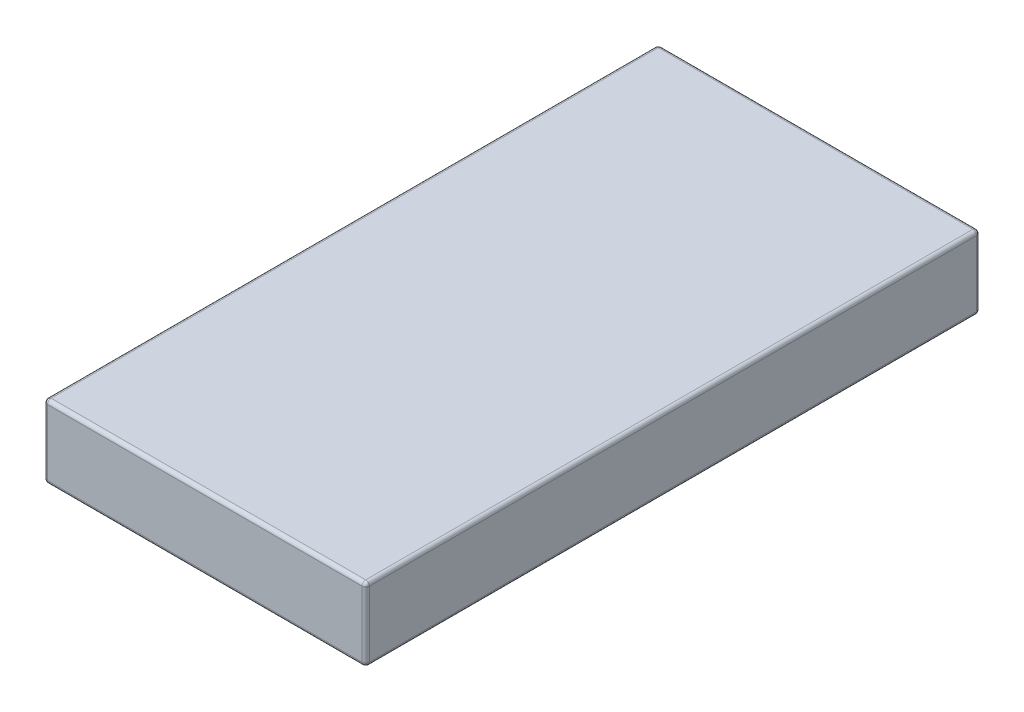
ISO-10303-21;
HEADER;
FILE_DESCRIPTION(('STEP AP214'),'2;1');
FILE_NAME('part.step','',(''),(''),'','','');
FILE_SCHEMA(('AUTOMOTIVE_DESIGN { 1 0 10303 214 1 1 1 1 }'));
ENDSEC;
DATA;
#1=APPLICATION_CONTEXT('core data for automotive mechanical design processes');
#2=APPLICATION_PROTOCOL_DEFINITION('international standard','automotive_design',2000,#1);
#3=PRODUCT_CONTEXT('',#1,'mechanical');
#4=PRODUCT('Part','Part','',(#3));
#5=PRODUCT_RELATED_PRODUCT_CATEGORY('part','',(#4));
#6=PRODUCT_DEFINITION_FORMATION('','',#4);
#7=PRODUCT_DEFINITION_CONTEXT('part definition',#1,'design');
#8=PRODUCT_DEFINITION('design','',#6,#7);
#9=PRODUCT_DEFINITION_SHAPE('','',#8);
#10=(LENGTH_UNIT() NAMED_UNIT(*) SI_UNIT(.MILLI.,.METRE.));
#11=(NAMED_UNIT(*) PLANE_ANGLE_UNIT() SI_UNIT($,.RADIAN.));
#12=(NAMED_UNIT(*) SI_UNIT($,.STERADIAN.) SOLID_ANGLE_UNIT());
#13=UNCERTAINTY_MEASURE_WITH_UNIT(LENGTH_MEASURE(1.E-05),#10,'distance_accuracy_value','');
#14=(GEOMETRIC_REPRESENTATION_CONTEXT(3) GLOBAL_UNCERTAINTY_ASSIGNED_CONTEXT((#13)) GLOBAL_UNIT_ASSIGNED_CONTEXT((#10,
#11,#12)) REPRESENTATION_CONTEXT('',''));
#15=CARTESIAN_POINT('',(0.,0.,0.));
#16=DIRECTION('',(0.,0.,1.));
#17=DIRECTION('',(1.,0.,0.));
#18=AXIS2_PLACEMENT_3D('',#15,#16,#17);
#19=CARTESIAN_POINT('',(0.,10.,0.));
#20=DIRECTION('',(1.,0.,0.));
#21=DIRECTION('',(0.,0.,-1.));
#22=AXIS2_PLACEMENT_3D('',#19,#20,#21);
#23=PLANE('',#22);
#24=DIRECTION('',(0.,-1.,0.));
#25=VECTOR('',#24,1.);
#26=CARTESIAN_POINT('',(0.,10.,-83.5));
#27=LINE('',#26,#25);
#28=CARTESIAN_POINT('',(0.,9.5,-83.5));
#29=VERTEX_POINT('',#28);
#30=CARTESIAN_POINT('',(0.,0.5,-83.5));
#31=VERTEX_POINT('',#30);
#32=EDGE_CURVE('E134',#29,#31,#27,.T.);
#33=ORIENTED_EDGE('',*,*,#32,.T.);
#34=DIRECTION('',(0.,0.,1.));
#35=VECTOR('',#34,1.);
#36=CARTESIAN_POINT('',(0.,0.5,0.));
#37=LINE('',#36,#35);
#38=CARTESIAN_POINT('',(0.,0.5,-0.5));
#39=VERTEX_POINT('',#38);
#40=EDGE_CURVE('E130',#31,#39,#37,.T.);
#41=ORIENTED_EDGE('',*,*,#40,.T.);
#42=DIRECTION('',(0.,-1.,0.));
#43=VECTOR('',#42,1.);
#44=CARTESIAN_POINT('',(0.,10.,-0.5));
#45=LINE('',#44,#43);
#46=CARTESIAN_POINT('',(0.,9.5,-0.5));
#47=VERTEX_POINT('',#46);
#48=EDGE_CURVE('E123',#39,#47,#45,.F.);
#49=ORIENTED_EDGE('',*,*,#48,.T.);
#50=DIRECTION('',(0.,0.,1.));
#51=VECTOR('',#50,1.);
#52=CARTESIAN_POINT('',(0.,9.5,0.));
#53=LINE('',#52,#51);
#54=EDGE_CURVE('E127',#47,#29,#53,.F.);
#55=ORIENTED_EDGE('',*,*,#54,.T.);
#56=EDGE_LOOP('',(#33,#41,#49,#55));
#57=FACE_BOUND('',#56,.T.);
#58=ADVANCED_FACE('F35',(#57),#23,.F.);
#59=CARTESIAN_POINT('',(0.,10.,0.));
#60=DIRECTION('',(0.,0.,-1.));
#61=DIRECTION('',(-1.,0.,0.));
#62=AXIS2_PLACEMENT_3D('',#59,#60,#61);
#63=PLANE('',#62);
#64=DIRECTION('',(0.,-1.,0.));
#65=VECTOR('',#64,1.);
#66=CARTESIAN_POINT('',(0.5,10.,0.));
#67=LINE('',#66,#65);
#68=CARTESIAN_POINT('',(0.5,9.5,0.));
#69=VERTEX_POINT('',#68);
#70=CARTESIAN_POINT('',(0.5,0.5,0.));
#71=VERTEX_POINT('',#70);
#72=EDGE_CURVE('E142',#69,#71,#67,.T.);
#73=ORIENTED_EDGE('',*,*,#72,.T.);
#74=DIRECTION('',(1.,0.,0.));
#75=VECTOR('',#74,1.);
#76=CARTESIAN_POINT('',(44.,0.5,0.));
#77=LINE('',#76,#75);
#78=CARTESIAN_POINT('',(43.5,0.5,0.));
#79=VERTEX_POINT('',#78);
#80=EDGE_CURVE('E189',#71,#79,#77,.T.);
#81=ORIENTED_EDGE('',*,*,#80,.T.);
#82=DIRECTION('',(0.,-1.,0.));
#83=VECTOR('',#82,1.);
#84=CARTESIAN_POINT('',(43.5,10.,0.));
#85=LINE('',#84,#83);
#86=CARTESIAN_POINT('',(43.5,9.5,0.));
#87=VERTEX_POINT('',#86);
#88=EDGE_CURVE('E186',#79,#87,#85,.F.);
#89=ORIENTED_EDGE('',*,*,#88,.T.);
#90=DIRECTION('',(1.,0.,0.));
#91=VECTOR('',#90,1.);
#92=CARTESIAN_POINT('',(0.,9.5,0.));
#93=LINE('',#92,#91);
#94=EDGE_CURVE('E184',#87,#69,#93,.F.);
#95=ORIENTED_EDGE('',*,*,#94,.T.);
#96=EDGE_LOOP('',(#73,#81,#89,#95));
#97=FACE_BOUND('',#96,.T.);
#98=ADVANCED_FACE('F295',(#97),#63,.F.);
#99=CARTESIAN_POINT('',(44.,10.,0.));
#100=DIRECTION('',(-1.,0.,0.));
#101=DIRECTION('',(0.,0.,1.));
#102=AXIS2_PLACEMENT_3D('',#99,#100,#101);
#103=PLANE('',#102);
#104=DIRECTION('',(0.,-1.,0.));
#105=VECTOR('',#104,1.);
#106=CARTESIAN_POINT('',(44.,10.,-0.5));
#107=LINE('',#106,#105);
#108=CARTESIAN_POINT('',(44.,9.5,-0.5));
#109=VERTEX_POINT('',#108);
#110=CARTESIAN_POINT('',(44.,0.5,-0.5));
#111=VERTEX_POINT('',#110);
#112=EDGE_CURVE('E177',#109,#111,#107,.T.);
#113=ORIENTED_EDGE('',*,*,#112,.T.);
#114=DIRECTION('',(0.,0.,-1.));
#115=VECTOR('',#114,1.);
#116=CARTESIAN_POINT('',(44.,0.5,-84.));
#117=LINE('',#116,#115);
#118=CARTESIAN_POINT('',(44.,0.5,-83.5));
#119=VERTEX_POINT('',#118);
#120=EDGE_CURVE('E182',#111,#119,#117,.T.);
#121=ORIENTED_EDGE('',*,*,#120,.T.);
#122=DIRECTION('',(0.,-1.,0.));
#123=VECTOR('',#122,1.);
#124=CARTESIAN_POINT('',(44.,10.,-83.5));
#125=LINE('',#124,#123);
#126=CARTESIAN_POINT('',(44.,9.5,-83.5));
#127=VERTEX_POINT('',#126);
#128=EDGE_CURVE('E179',#119,#127,#125,.F.);
#129=ORIENTED_EDGE('',*,*,#128,.T.);
#130=DIRECTION('',(0.,0.,-1.));
#131=VECTOR('',#130,1.);
#132=CARTESIAN_POINT('',(44.,9.5,0.));
#133=LINE('',#132,#131);
#134=EDGE_CURVE('E175',#127,#109,#133,.F.);
#135=ORIENTED_EDGE('',*,*,#134,.T.);
#136=EDGE_LOOP('',(#113,#121,#129,#135));
#137=FACE_BOUND('',#136,.T.);
#138=ADVANCED_FACE('F274',(#137),#103,.F.);
#139=CARTESIAN_POINT('',(0.,10.,-84.));
#140=DIRECTION('',(0.,0.,1.));
#141=DIRECTION('',(1.,0.,0.));
#142=AXIS2_PLACEMENT_3D('',#139,#140,#141);
#143=PLANE('',#142);
#144=DIRECTION('',(0.,-1.,0.));
#145=VECTOR('',#144,1.);
#146=CARTESIAN_POINT('',(43.5,10.,-84.));
#147=LINE('',#146,#145);
#148=CARTESIAN_POINT('',(43.5,9.5,-84.));
#149=VERTEX_POINT('',#148);
#150=CARTESIAN_POINT('',(43.5,0.5,-84.));
#151=VERTEX_POINT('',#150);
#152=EDGE_CURVE('E168',#149,#151,#147,.T.);
#153=ORIENTED_EDGE('',*,*,#152,.T.);
#154=DIRECTION('',(-1.,0.,0.));
#155=VECTOR('',#154,1.);
#156=CARTESIAN_POINT('',(0.,0.5,-84.));
#157=LINE('',#156,#155);
#158=CARTESIAN_POINT('',(0.499999999999986,0.5,-84.));
#159=VERTEX_POINT('',#158);
#160=EDGE_CURVE('E173',#151,#159,#157,.T.);
#161=ORIENTED_EDGE('',*,*,#160,.T.);
#162=DIRECTION('',(0.,-1.,0.));
#163=VECTOR('',#162,1.);
#164=CARTESIAN_POINT('',(0.499999999999986,10.,-84.));
#165=LINE('',#164,#163);
#166=CARTESIAN_POINT('',(0.499999999999986,9.5,-84.));
#167=VERTEX_POINT('',#166);
#168=EDGE_CURVE('E170',#159,#167,#165,.F.);
#169=ORIENTED_EDGE('',*,*,#168,.T.);
#170=DIRECTION('',(-1.,0.,0.));
#171=VECTOR('',#170,1.);
#172=CARTESIAN_POINT('',(0.,9.5,-84.));
#173=LINE('',#172,#171);
#174=EDGE_CURVE('E166',#167,#149,#173,.F.);
#175=ORIENTED_EDGE('',*,*,#174,.T.);
#176=EDGE_LOOP('',(#153,#161,#169,#175));
#177=FACE_BOUND('',#176,.T.);
#178=ADVANCED_FACE('F302',(#177),#143,.F.);
#179=CARTESIAN_POINT('',(0.,10.,0.));
#180=DIRECTION('',(0.,-1.,0.));
#181=DIRECTION('',(0.,0.,-1.));
#182=AXIS2_PLACEMENT_3D('',#179,#180,#181);
#183=PLANE('',#182);
#184=DIRECTION('',(0.,0.,-1.));
#185=VECTOR('',#184,1.);
#186=CARTESIAN_POINT('',(43.5,10.,0.));
#187=LINE('',#186,#185);
#188=CARTESIAN_POINT('',(43.5,10.,-0.5));
#189=VERTEX_POINT('',#188);
#190=CARTESIAN_POINT('',(43.5,10.,-83.5));
#191=VERTEX_POINT('',#190);
#192=EDGE_CURVE('E44',#189,#191,#187,.T.);
#193=ORIENTED_EDGE('',*,*,#192,.T.);
#194=DIRECTION('',(-1.,0.,0.));
#195=VECTOR('',#194,1.);
#196=CARTESIAN_POINT('',(0.,10.,-83.5));
#197=LINE('',#196,#195);
#198=CARTESIAN_POINT('',(0.499999999999986,10.,-83.5));
#199=VERTEX_POINT('',#198);
#200=EDGE_CURVE('E11',#191,#199,#197,.T.);
#201=ORIENTED_EDGE('',*,*,#200,.T.);
#202=DIRECTION('',(0.,0.,1.));
#203=VECTOR('',#202,1.);
#204=CARTESIAN_POINT('',(0.5,10.,0.));
#205=LINE('',#204,#203);
#206=CARTESIAN_POINT('',(0.5,10.,-0.5));
#207=VERTEX_POINT('',#206);
#208=EDGE_CURVE('E200',#199,#207,#205,.T.);
#209=ORIENTED_EDGE('',*,*,#208,.T.);
#210=DIRECTION('',(1.,0.,0.));
#211=VECTOR('',#210,1.);
#212=CARTESIAN_POINT('',(0.,10.,-0.5));
#213=LINE('',#212,#211);
#214=EDGE_CURVE('E55',#207,#189,#213,.T.);
#215=ORIENTED_EDGE('',*,*,#214,.T.);
#216=EDGE_LOOP('',(#193,#201,#209,#215));
#217=FACE_BOUND('',#216,.T.);
#218=ADVANCED_FACE('F366',(#217),#183,.F.);
#219=CARTESIAN_POINT('',(0.,0.,0.));
#220=DIRECTION('',(0.,-1.,0.));
#221=DIRECTION('',(0.,0.,-1.));
#222=AXIS2_PLACEMENT_3D('',#219,#220,#221);
#223=PLANE('',#222);
#224=DIRECTION('',(0.,0.,-1.));
#225=VECTOR('',#224,1.);
#226=CARTESIAN_POINT('',(43.5,0.,0.));
#227=LINE('',#226,#225);
#228=CARTESIAN_POINT('',(43.5,0.,-83.5));
#229=VERTEX_POINT('',#228);
#230=CARTESIAN_POINT('',(43.5,0.,-0.5));
#231=VERTEX_POINT('',#230);
#232=EDGE_CURVE('E195',#229,#231,#227,.F.);
#233=ORIENTED_EDGE('',*,*,#232,.T.);
#234=DIRECTION('',(1.,0.,0.));
#235=VECTOR('',#234,1.);
#236=CARTESIAN_POINT('',(0.,0.,-0.5));
#237=LINE('',#236,#235);
#238=CARTESIAN_POINT('',(0.5,0.,-0.5));
#239=VERTEX_POINT('',#238);
#240=EDGE_CURVE('E197',#231,#239,#237,.F.);
#241=ORIENTED_EDGE('',*,*,#240,.T.);
#242=DIRECTION('',(0.,0.,1.));
#243=VECTOR('',#242,1.);
#244=CARTESIAN_POINT('',(0.499999999999986,0.,-84.));
#245=LINE('',#244,#243);
#246=CARTESIAN_POINT('',(0.499999999999986,0.,-83.5));
#247=VERTEX_POINT('',#246);
#248=EDGE_CURVE('E191',#239,#247,#245,.F.);
#249=ORIENTED_EDGE('',*,*,#248,.T.);
#250=DIRECTION('',(-1.,0.,0.));
#251=VECTOR('',#250,1.);
#252=CARTESIAN_POINT('',(44.,0.,-83.5));
#253=LINE('',#252,#251);
#254=EDGE_CURVE('E193',#247,#229,#253,.F.);
#255=ORIENTED_EDGE('',*,*,#254,.T.);
#256=EDGE_LOOP('',(#233,#241,#249,#255));
#257=FACE_BOUND('',#256,.T.);
#258=ADVANCED_FACE('F266',(#257),#223,.T.);
#259=CARTESIAN_POINT('',(43.5,10.,-0.5));
#260=DIRECTION('',(0.,-1.,0.));
#261=DIRECTION('',(0.,0.,-1.));
#262=AXIS2_PLACEMENT_3D('',#259,#260,#261);
#263=CYLINDRICAL_SURFACE('',#262,0.5);
#264=CARTESIAN_POINT('',(43.5,9.5,-0.5));
#265=DIRECTION('',(0.,1.,0.));
#266=DIRECTION('',(0.,0.,1.));
#267=AXIS2_PLACEMENT_3D('',#264,#265,#266);
#268=CIRCLE('',#267,0.5);
#269=EDGE_CURVE('E39',#87,#109,#268,.T.);
#270=ORIENTED_EDGE('',*,*,#269,.F.);
#271=ORIENTED_EDGE('',*,*,#88,.F.);
#272=CARTESIAN_POINT('',(43.5,0.5,-0.5));
#273=DIRECTION('',(0.,-1.,0.));
#274=DIRECTION('',(0.,0.,-1.));
#275=AXIS2_PLACEMENT_3D('',#272,#273,#274);
#276=CIRCLE('',#275,0.5);
#277=EDGE_CURVE('E162',#111,#79,#276,.T.);
#278=ORIENTED_EDGE('',*,*,#277,.F.);
#279=ORIENTED_EDGE('',*,*,#112,.F.);
#280=EDGE_LOOP('',(#270,#271,#278,#279));
#281=FACE_BOUND('',#280,.T.);
#282=ADVANCED_FACE('F37',(#281),#263,.T.);
#283=CARTESIAN_POINT('',(43.5,9.5,-0.5));
#284=DIRECTION('',(0.,0.,1.));
#285=DIRECTION('',(1.,0.,0.));
#286=AXIS2_PLACEMENT_3D('',#283,#284,#285);
#287=SPHERICAL_SURFACE('',#286,0.5);
#288=CARTESIAN_POINT('',(43.5,9.5,-0.5));
#289=DIRECTION('',(1.,0.,0.));
#290=DIRECTION('',(0.,0.,-1.));
#291=AXIS2_PLACEMENT_3D('',#288,#289,#290);
#292=CIRCLE('',#291,0.5);
#293=EDGE_CURVE('E246',#87,#189,#292,.F.);
#294=ORIENTED_EDGE('',*,*,#293,.F.);
#295=ORIENTED_EDGE('',*,*,#269,.T.);
#296=CARTESIAN_POINT('',(43.5,9.5,-0.5));
#297=DIRECTION('',(0.,0.,1.));
#298=DIRECTION('',(1.,0.,0.));
#299=AXIS2_PLACEMENT_3D('',#296,#297,#298);
#300=CIRCLE('',#299,0.5);
#301=EDGE_CURVE('E248',#189,#109,#300,.F.);
#302=ORIENTED_EDGE('',*,*,#301,.F.);
#303=EDGE_LOOP('',(#294,#295,#302));
#304=FACE_BOUND('',#303,.T.);
#305=ADVANCED_FACE('F290',(#304),#287,.T.);
#306=CARTESIAN_POINT('',(43.5,0.5,-0.5));
#307=DIRECTION('',(0.,0.,1.));
#308=DIRECTION('',(1.,0.,0.));
#309=AXIS2_PLACEMENT_3D('',#306,#307,#308);
#310=SPHERICAL_SURFACE('',#309,0.5);
#311=CARTESIAN_POINT('',(43.5,0.5,-0.5));
#312=DIRECTION('',(0.,0.,1.));
#313=DIRECTION('',(1.,0.,0.));
#314=AXIS2_PLACEMENT_3D('',#311,#312,#313);
#315=CIRCLE('',#314,0.5);
#316=EDGE_CURVE('E240',#111,#231,#315,.F.);
#317=ORIENTED_EDGE('',*,*,#316,.F.);
#318=ORIENTED_EDGE('',*,*,#277,.T.);
#319=CARTESIAN_POINT('',(43.5,0.5,-0.5));
#320=DIRECTION('',(1.,0.,0.));
#321=DIRECTION('',(0.,0.,-1.));
#322=AXIS2_PLACEMENT_3D('',#319,#320,#321);
#323=CIRCLE('',#322,0.5);
#324=EDGE_CURVE('E243',#231,#79,#323,.F.);
#325=ORIENTED_EDGE('',*,*,#324,.F.);
#326=EDGE_LOOP('',(#317,#318,#325));
#327=FACE_BOUND('',#326,.T.);
#328=ADVANCED_FACE('F255',(#327),#310,.T.);
#329=CARTESIAN_POINT('',(43.5,9.5,0.));
#330=DIRECTION('',(0.,0.,-1.));
#331=DIRECTION('',(-1.,0.,0.));
#332=AXIS2_PLACEMENT_3D('',#329,#330,#331);
#333=CYLINDRICAL_SURFACE('',#332,0.5);
#334=ORIENTED_EDGE('',*,*,#301,.T.);
#335=ORIENTED_EDGE('',*,*,#134,.F.);
#336=CARTESIAN_POINT('',(43.5,9.5,-83.5));
#337=DIRECTION('',(0.,0.,-1.));
#338=DIRECTION('',(-1.,0.,0.));
#339=AXIS2_PLACEMENT_3D('',#336,#337,#338);
#340=CIRCLE('',#339,0.5);
#341=EDGE_CURVE('E235',#191,#127,#340,.T.);
#342=ORIENTED_EDGE('',*,*,#341,.F.);
#343=ORIENTED_EDGE('',*,*,#192,.F.);
#344=EDGE_LOOP('',(#334,#335,#342,#343));
#345=FACE_BOUND('',#344,.T.);
#346=ADVANCED_FACE('F285',(#345),#333,.T.);
#347=CARTESIAN_POINT('',(0.,9.5,-0.5));
#348=DIRECTION('',(1.,0.,0.));
#349=DIRECTION('',(0.,0.,-1.));
#350=AXIS2_PLACEMENT_3D('',#347,#348,#349);
#351=CYLINDRICAL_SURFACE('',#350,0.5);
#352=ORIENTED_EDGE('',*,*,#293,.T.);
#353=ORIENTED_EDGE('',*,*,#214,.F.);
#354=CARTESIAN_POINT('',(0.5,9.5,-0.5));
#355=DIRECTION('',(-1.,0.,0.));
#356=DIRECTION('',(0.,0.,1.));
#357=AXIS2_PLACEMENT_3D('',#354,#355,#356);
#358=CIRCLE('',#357,0.5);
#359=EDGE_CURVE('E146',#69,#207,#358,.T.);
#360=ORIENTED_EDGE('',*,*,#359,.F.);
#361=ORIENTED_EDGE('',*,*,#94,.F.);
#362=EDGE_LOOP('',(#352,#353,#360,#361));
#363=FACE_BOUND('',#362,.T.);
#364=ADVANCED_FACE('F293',(#363),#351,.T.);
#365=CARTESIAN_POINT('',(0.5,10.,-0.5));
#366=DIRECTION('',(0.,-1.,0.));
#367=DIRECTION('',(0.,0.,-1.));
#368=AXIS2_PLACEMENT_3D('',#365,#366,#367);
#369=CYLINDRICAL_SURFACE('',#368,0.5);
#370=CARTESIAN_POINT('',(0.5,0.5,-0.5));
#371=DIRECTION('',(0.,-1.,0.));
#372=DIRECTION('',(0.,0.,-1.));
#373=AXIS2_PLACEMENT_3D('',#370,#371,#372);
#374=CIRCLE('',#373,0.5);
#375=EDGE_CURVE('E147',#71,#39,#374,.T.);
#376=ORIENTED_EDGE('',*,*,#375,.F.);
#377=ORIENTED_EDGE('',*,*,#72,.F.);
#378=CARTESIAN_POINT('',(0.5,9.5,-0.5));
#379=DIRECTION('',(0.,1.,0.));
#380=DIRECTION('',(0.,0.,1.));
#381=AXIS2_PLACEMENT_3D('',#378,#379,#380);
#382=CIRCLE('',#381,0.5);
#383=EDGE_CURVE('E138',#47,#69,#382,.T.);
#384=ORIENTED_EDGE('',*,*,#383,.F.);
#385=ORIENTED_EDGE('',*,*,#48,.F.);
#386=EDGE_LOOP('',(#376,#377,#384,#385));
#387=FACE_BOUND('',#386,.T.);
#388=ADVANCED_FACE('F140',(#387),#369,.T.);
#389=CARTESIAN_POINT('',(0.,0.5,-0.5));
#390=DIRECTION('',(-1.,0.,0.));
#391=DIRECTION('',(0.,0.,1.));
#392=AXIS2_PLACEMENT_3D('',#389,#390,#391);
#393=CYLINDRICAL_SURFACE('',#392,0.5);
#394=ORIENTED_EDGE('',*,*,#324,.T.);
#395=ORIENTED_EDGE('',*,*,#80,.F.);
#396=CARTESIAN_POINT('',(0.5,0.5,-0.5));
#397=DIRECTION('',(-1.,0.,0.));
#398=DIRECTION('',(0.,0.,1.));
#399=AXIS2_PLACEMENT_3D('',#396,#397,#398);
#400=CIRCLE('',#399,0.5);
#401=EDGE_CURVE('E231',#239,#71,#400,.T.);
#402=ORIENTED_EDGE('',*,*,#401,.F.);
#403=ORIENTED_EDGE('',*,*,#240,.F.);
#404=EDGE_LOOP('',(#394,#395,#402,#403));
#405=FACE_BOUND('',#404,.T.);
#406=ADVANCED_FACE('F263',(#405),#393,.T.);
#407=CARTESIAN_POINT('',(43.5,0.5,0.));
#408=DIRECTION('',(0.,0.,1.));
#409=DIRECTION('',(1.,0.,0.));
#410=AXIS2_PLACEMENT_3D('',#407,#408,#409);
#411=CYLINDRICAL_SURFACE('',#410,0.5);
#412=ORIENTED_EDGE('',*,*,#316,.T.);
#413=ORIENTED_EDGE('',*,*,#232,.F.);
#414=CARTESIAN_POINT('',(43.5,0.5,-83.5));
#415=DIRECTION('',(0.,0.,-1.));
#416=DIRECTION('',(-1.,0.,0.));
#417=AXIS2_PLACEMENT_3D('',#414,#415,#416);
#418=CIRCLE('',#417,0.5);
#419=EDGE_CURVE('E228',#119,#229,#418,.T.);
#420=ORIENTED_EDGE('',*,*,#419,.F.);
#421=ORIENTED_EDGE('',*,*,#120,.F.);
#422=EDGE_LOOP('',(#412,#413,#420,#421));
#423=FACE_BOUND('',#422,.T.);
#424=ADVANCED_FACE('F271',(#423),#411,.T.);
#425=CARTESIAN_POINT('',(43.5,10.,-83.5));
#426=DIRECTION('',(0.,-1.,0.));
#427=DIRECTION('',(0.,0.,-1.));
#428=AXIS2_PLACEMENT_3D('',#425,#426,#427);
#429=CYLINDRICAL_SURFACE('',#428,0.5);
#430=CARTESIAN_POINT('',(43.5,9.5,-83.5));
#431=DIRECTION('',(0.,1.,0.));
#432=DIRECTION('',(0.,0.,1.));
#433=AXIS2_PLACEMENT_3D('',#430,#431,#432);
#434=CIRCLE('',#433,0.5);
#435=EDGE_CURVE('E237',#127,#149,#434,.T.);
#436=ORIENTED_EDGE('',*,*,#435,.F.);
#437=ORIENTED_EDGE('',*,*,#128,.F.);
#438=CARTESIAN_POINT('',(43.5,0.5,-83.5));
#439=DIRECTION('',(0.,-1.,0.));
#440=DIRECTION('',(0.,0.,-1.));
#441=AXIS2_PLACEMENT_3D('',#438,#439,#440);
#442=CIRCLE('',#441,0.5);
#443=EDGE_CURVE('E225',#151,#119,#442,.T.);
#444=ORIENTED_EDGE('',*,*,#443,.F.);
#445=ORIENTED_EDGE('',*,*,#152,.F.);
#446=EDGE_LOOP('',(#436,#437,#444,#445));
#447=FACE_BOUND('',#446,.T.);
#448=ADVANCED_FACE('F278',(#447),#429,.T.);
#449=CARTESIAN_POINT('',(43.5,9.5,-83.5));
#450=DIRECTION('',(0.,0.,1.));
#451=DIRECTION('',(1.,0.,0.));
#452=AXIS2_PLACEMENT_3D('',#449,#450,#451);
#453=SPHERICAL_SURFACE('',#452,0.5);
#454=ORIENTED_EDGE('',*,*,#341,.T.);
#455=ORIENTED_EDGE('',*,*,#435,.T.);
#456=CARTESIAN_POINT('',(43.5,9.5,-83.5));
#457=DIRECTION('',(1.,0.,0.));
#458=DIRECTION('',(0.,0.,-1.));
#459=AXIS2_PLACEMENT_3D('',#456,#457,#458);
#460=CIRCLE('',#459,0.5);
#461=EDGE_CURVE('E154',#191,#149,#460,.F.);
#462=ORIENTED_EDGE('',*,*,#461,.F.);
#463=EDGE_LOOP('',(#454,#455,#462));
#464=FACE_BOUND('',#463,.T.);
#465=ADVANCED_FACE('F343',(#464),#453,.T.);
#466=CARTESIAN_POINT('',(0.5,9.5,-0.5));
#467=DIRECTION('',(0.,0.,1.));
#468=DIRECTION('',(1.,0.,0.));
#469=AXIS2_PLACEMENT_3D('',#466,#467,#468);
#470=SPHERICAL_SURFACE('',#469,0.5);
#471=ORIENTED_EDGE('',*,*,#383,.T.);
#472=ORIENTED_EDGE('',*,*,#359,.T.);
#473=CARTESIAN_POINT('',(0.5,9.5,-0.5));
#474=DIRECTION('',(0.,0.,1.));
#475=DIRECTION('',(1.,0.,0.));
#476=AXIS2_PLACEMENT_3D('',#473,#474,#475);
#477=CIRCLE('',#476,0.5);
#478=EDGE_CURVE('E150',#47,#207,#477,.F.);
#479=ORIENTED_EDGE('',*,*,#478,.F.);
#480=EDGE_LOOP('',(#471,#472,#479));
#481=FACE_BOUND('',#480,.T.);
#482=ADVANCED_FACE('F151',(#481),#470,.T.);
#483=CARTESIAN_POINT('',(0.5,0.5,-0.5));
#484=DIRECTION('',(0.,0.,1.));
#485=DIRECTION('',(1.,0.,0.));
#486=AXIS2_PLACEMENT_3D('',#483,#484,#485);
#487=SPHERICAL_SURFACE('',#486,0.5);
#488=ORIENTED_EDGE('',*,*,#401,.T.);
#489=ORIENTED_EDGE('',*,*,#375,.T.);
#490=CARTESIAN_POINT('',(0.5,0.5,-0.5));
#491=DIRECTION('',(0.,0.,1.));
#492=DIRECTION('',(1.,0.,0.));
#493=AXIS2_PLACEMENT_3D('',#490,#491,#492);
#494=CIRCLE('',#493,0.5);
#495=EDGE_CURVE('E155',#239,#39,#494,.F.);
#496=ORIENTED_EDGE('',*,*,#495,.F.);
#497=EDGE_LOOP('',(#488,#489,#496));
#498=FACE_BOUND('',#497,.T.);
#499=ADVANCED_FACE('F336',(#498),#487,.T.);
#500=CARTESIAN_POINT('',(43.5,0.5,-83.5));
#501=DIRECTION('',(0.,0.,1.));
#502=DIRECTION('',(1.,0.,0.));
#503=AXIS2_PLACEMENT_3D('',#500,#501,#502);
#504=SPHERICAL_SURFACE('',#503,0.5);
#505=ORIENTED_EDGE('',*,*,#443,.T.);
#506=ORIENTED_EDGE('',*,*,#419,.T.);
#507=CARTESIAN_POINT('',(43.5,0.5,-83.5));
#508=DIRECTION('',(1.,0.,0.));
#509=DIRECTION('',(0.,0.,-1.));
#510=AXIS2_PLACEMENT_3D('',#507,#508,#509);
#511=CIRCLE('',#510,0.5);
#512=EDGE_CURVE('E218',#151,#229,#511,.F.);
#513=ORIENTED_EDGE('',*,*,#512,.F.);
#514=EDGE_LOOP('',(#505,#506,#513));
#515=FACE_BOUND('',#514,.T.);
#516=ADVANCED_FACE('F332',(#515),#504,.T.);
#517=CARTESIAN_POINT('',(0.,9.5,-83.5));
#518=DIRECTION('',(-1.,0.,0.));
#519=DIRECTION('',(0.,0.,1.));
#520=AXIS2_PLACEMENT_3D('',#517,#518,#519);
#521=CYLINDRICAL_SURFACE('',#520,0.5);
#522=ORIENTED_EDGE('',*,*,#461,.T.);
#523=ORIENTED_EDGE('',*,*,#174,.F.);
#524=CARTESIAN_POINT('',(0.499999999999986,9.5,-83.5));
#525=DIRECTION('',(-1.,0.,0.));
#526=DIRECTION('',(0.,0.,1.));
#527=AXIS2_PLACEMENT_3D('',#524,#525,#526);
#528=CIRCLE('',#527,0.5);
#529=EDGE_CURVE('E215',#199,#167,#528,.T.);
#530=ORIENTED_EDGE('',*,*,#529,.F.);
#531=ORIENTED_EDGE('',*,*,#200,.F.);
#532=EDGE_LOOP('',(#522,#523,#530,#531));
#533=FACE_BOUND('',#532,.T.);
#534=ADVANCED_FACE('F329',(#533),#521,.T.);
#535=CARTESIAN_POINT('',(0.5,9.5,0.));
#536=DIRECTION('',(0.,0.,1.));
#537=DIRECTION('',(1.,0.,0.));
#538=AXIS2_PLACEMENT_3D('',#535,#536,#537);
#539=CYLINDRICAL_SURFACE('',#538,0.5);
#540=ORIENTED_EDGE('',*,*,#478,.T.);
#541=ORIENTED_EDGE('',*,*,#208,.F.);
#542=CARTESIAN_POINT('',(0.499999999999986,9.5,-83.5));
#543=DIRECTION('',(0.,0.,-1.));
#544=DIRECTION('',(-1.,0.,0.));
#545=AXIS2_PLACEMENT_3D('',#542,#543,#544);
#546=CIRCLE('',#545,0.5);
#547=EDGE_CURVE('E158',#29,#199,#546,.T.);
#548=ORIENTED_EDGE('',*,*,#547,.F.);
#549=ORIENTED_EDGE('',*,*,#54,.F.);
#550=EDGE_LOOP('',(#540,#541,#548,#549));
#551=FACE_BOUND('',#550,.T.);
#552=ADVANCED_FACE('F157',(#551),#539,.T.);
#553=CARTESIAN_POINT('',(0.5,0.5,0.));
#554=DIRECTION('',(0.,0.,-1.));
#555=DIRECTION('',(-1.,0.,0.));
#556=AXIS2_PLACEMENT_3D('',#553,#554,#555);
#557=CYLINDRICAL_SURFACE('',#556,0.5);
#558=ORIENTED_EDGE('',*,*,#495,.T.);
#559=ORIENTED_EDGE('',*,*,#40,.F.);
#560=CARTESIAN_POINT('',(0.499999999999986,0.5,-83.5));
#561=DIRECTION('',(0.,0.,-1.));
#562=DIRECTION('',(-1.,0.,0.));
#563=AXIS2_PLACEMENT_3D('',#560,#561,#562);
#564=CIRCLE('',#563,0.5);
#565=EDGE_CURVE('E211',#247,#31,#564,.T.);
#566=ORIENTED_EDGE('',*,*,#565,.F.);
#567=ORIENTED_EDGE('',*,*,#248,.F.);
#568=EDGE_LOOP('',(#558,#559,#566,#567));
#569=FACE_BOUND('',#568,.T.);
#570=ADVANCED_FACE('F322',(#569),#557,.T.);
#571=CARTESIAN_POINT('',(0.,0.5,-83.5));
#572=DIRECTION('',(1.,0.,0.));
#573=DIRECTION('',(0.,0.,-1.));
#574=AXIS2_PLACEMENT_3D('',#571,#572,#573);
#575=CYLINDRICAL_SURFACE('',#574,0.5);
#576=ORIENTED_EDGE('',*,*,#512,.T.);
#577=ORIENTED_EDGE('',*,*,#254,.F.);
#578=CARTESIAN_POINT('',(0.499999999999986,0.5,-83.5));
#579=DIRECTION('',(-1.,0.,0.));
#580=DIRECTION('',(0.,0.,1.));
#581=AXIS2_PLACEMENT_3D('',#578,#579,#580);
#582=CIRCLE('',#581,0.5);
#583=EDGE_CURVE('E208',#159,#247,#582,.T.);
#584=ORIENTED_EDGE('',*,*,#583,.F.);
#585=ORIENTED_EDGE('',*,*,#160,.F.);
#586=EDGE_LOOP('',(#576,#577,#584,#585));
#587=FACE_BOUND('',#586,.T.);
#588=ADVANCED_FACE('F318',(#587),#575,.T.);
#589=CARTESIAN_POINT('',(0.499999999999986,9.5,-83.5));
#590=DIRECTION('',(0.,0.,1.));
#591=DIRECTION('',(1.,0.,0.));
#592=AXIS2_PLACEMENT_3D('',#589,#590,#591);
#593=SPHERICAL_SURFACE('',#592,0.5);
#594=ORIENTED_EDGE('',*,*,#547,.T.);
#595=ORIENTED_EDGE('',*,*,#529,.T.);
#596=CARTESIAN_POINT('',(0.499999999999986,9.5,-83.5));
#597=DIRECTION('',(0.,1.,0.));
#598=DIRECTION('',(0.,0.,1.));
#599=AXIS2_PLACEMENT_3D('',#596,#597,#598);
#600=CIRCLE('',#599,0.5);
#601=EDGE_CURVE('E206',#29,#167,#600,.F.);
#602=ORIENTED_EDGE('',*,*,#601,.F.);
#603=EDGE_LOOP('',(#594,#595,#602));
#604=FACE_BOUND('',#603,.T.);
#605=ADVANCED_FACE('F314',(#604),#593,.T.);
#606=CARTESIAN_POINT('',(0.499999999999986,0.5,-83.5));
#607=DIRECTION('',(0.,0.,1.));
#608=DIRECTION('',(1.,0.,0.));
#609=AXIS2_PLACEMENT_3D('',#606,#607,#608);
#610=SPHERICAL_SURFACE('',#609,0.5);
#611=ORIENTED_EDGE('',*,*,#583,.T.);
#612=ORIENTED_EDGE('',*,*,#565,.T.);
#613=CARTESIAN_POINT('',(0.499999999999986,0.5,-83.5));
#614=DIRECTION('',(0.,-1.,0.));
#615=DIRECTION('',(0.,0.,-1.));
#616=AXIS2_PLACEMENT_3D('',#613,#614,#615);
#617=CIRCLE('',#616,0.5);
#618=EDGE_CURVE('E204',#159,#31,#617,.F.);
#619=ORIENTED_EDGE('',*,*,#618,.F.);
#620=EDGE_LOOP('',(#611,#612,#619));
#621=FACE_BOUND('',#620,.T.);
#622=ADVANCED_FACE('F310',(#621),#610,.T.);
#623=CARTESIAN_POINT('',(0.499999999999986,10.,-83.5));
#624=DIRECTION('',(0.,-1.,0.));
#625=DIRECTION('',(0.,0.,-1.));
#626=AXIS2_PLACEMENT_3D('',#623,#624,#625);
#627=CYLINDRICAL_SURFACE('',#626,0.5);
#628=ORIENTED_EDGE('',*,*,#601,.T.);
#629=ORIENTED_EDGE('',*,*,#168,.F.);
#630=ORIENTED_EDGE('',*,*,#618,.T.);
#631=ORIENTED_EDGE('',*,*,#32,.F.);
#632=EDGE_LOOP('',(#628,#629,#630,#631));
#633=FACE_BOUND('',#632,.T.);
#634=ADVANCED_FACE('F307',(#633),#627,.T.);
#635=CLOSED_SHELL('',(#58,#98,#138,#178,#218,#258,#282,#305,#328,#346,#364,#388,#406,#424,#448,
#465,#482,#499,#516,#534,#552,#570,#588,#605,#622,#634));
#636=MANIFOLD_SOLID_BREP('B2',#635);
#637=ADVANCED_BREP_SHAPE_REPRESENTATION('',(#18,#636),#14);
#638=SHAPE_DEFINITION_REPRESENTATION(#9,#637);
ENDSEC;
END-ISO-10303-21;
